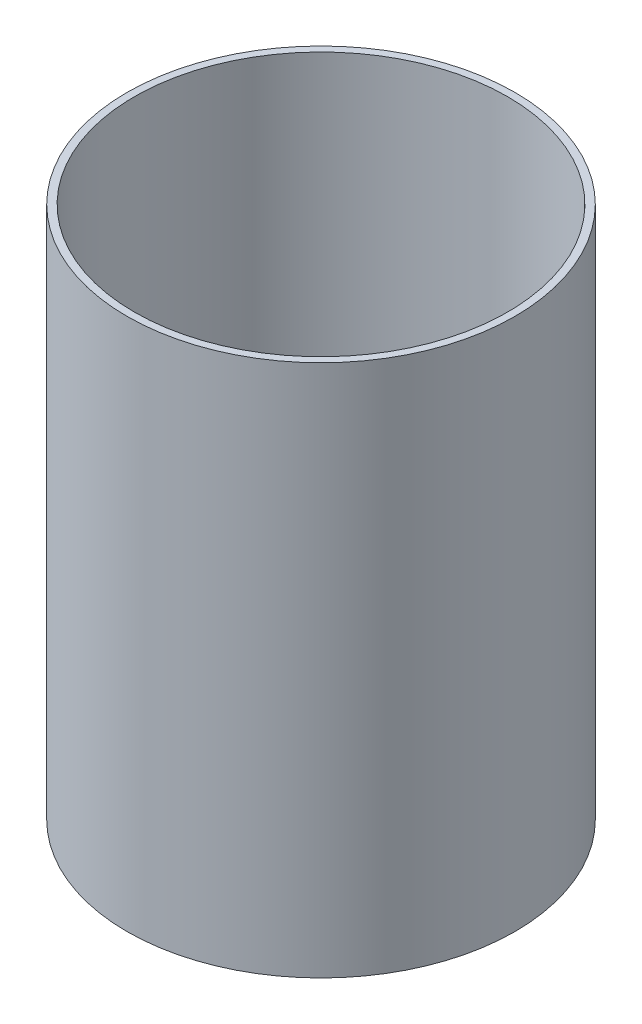
ISO-10303-21;
HEADER;
FILE_DESCRIPTION(('STEP AP214'),'2;1');
FILE_NAME('part.step','',(''),(''),'','','');
FILE_SCHEMA(('AUTOMOTIVE_DESIGN { 1 0 10303 214 1 1 1 1 }'));
ENDSEC;
DATA;
#1=APPLICATION_CONTEXT('core data for automotive mechanical design processes');
#2=APPLICATION_PROTOCOL_DEFINITION('international standard','automotive_design',2000,#1);
#3=PRODUCT_CONTEXT('',#1,'mechanical');
#4=PRODUCT('Part','Part','',(#3));
#5=PRODUCT_RELATED_PRODUCT_CATEGORY('part','',(#4));
#6=PRODUCT_DEFINITION_FORMATION('','',#4);
#7=PRODUCT_DEFINITION_CONTEXT('part definition',#1,'design');
#8=PRODUCT_DEFINITION('design','',#6,#7);
#9=PRODUCT_DEFINITION_SHAPE('','',#8);
#10=(LENGTH_UNIT() NAMED_UNIT(*) SI_UNIT(.MILLI.,.METRE.));
#11=(NAMED_UNIT(*) PLANE_ANGLE_UNIT() SI_UNIT($,.RADIAN.));
#12=(NAMED_UNIT(*) SI_UNIT($,.STERADIAN.) SOLID_ANGLE_UNIT());
#13=UNCERTAINTY_MEASURE_WITH_UNIT(LENGTH_MEASURE(1.E-05),#10,'distance_accuracy_value','');
#14=(GEOMETRIC_REPRESENTATION_CONTEXT(3) GLOBAL_UNCERTAINTY_ASSIGNED_CONTEXT((#13)) GLOBAL_UNIT_ASSIGNED_CONTEXT((#10,
#11,#12)) REPRESENTATION_CONTEXT('',''));
#15=CARTESIAN_POINT('',(0.,0.,0.));
#16=DIRECTION('',(0.,0.,1.));
#17=DIRECTION('',(1.,0.,0.));
#18=AXIS2_PLACEMENT_3D('',#15,#16,#17);
#19=CARTESIAN_POINT('',(0.,355.6,0.));
#20=DIRECTION('',(0.,1.,0.));
#21=DIRECTION('',(0.,0.,1.));
#22=AXIS2_PLACEMENT_3D('',#19,#20,#21);
#23=PLANE('',#22);
#24=CARTESIAN_POINT('',(0.,355.6,0.));
#25=DIRECTION('',(0.,1.,0.));
#26=DIRECTION('',(0.,0.,1.));
#27=AXIS2_PLACEMENT_3D('',#24,#25,#26);
#28=CIRCLE('',#27,132.);
#29=CARTESIAN_POINT('',(0.,355.6,132.));
#30=VERTEX_POINT('',#29);
#31=EDGE_CURVE('E11',#30,#30,#28,.T.);
#32=ORIENTED_EDGE('',*,*,#31,.T.);
#33=EDGE_LOOP('',(#32));
#34=FACE_BOUND('',#33,.T.);
#35=CARTESIAN_POINT('',(0.,355.6,0.));
#36=DIRECTION('',(0.,1.,0.));
#37=DIRECTION('',(0.,0.,1.));
#38=AXIS2_PLACEMENT_3D('',#35,#36,#37);
#39=CIRCLE('',#38,127.);
#40=CARTESIAN_POINT('',(0.,355.6,127.));
#41=VERTEX_POINT('',#40);
#42=EDGE_CURVE('E53',#41,#41,#39,.T.);
#43=ORIENTED_EDGE('',*,*,#42,.F.);
#44=EDGE_LOOP('',(#43));
#45=FACE_BOUND('',#44,.T.);
#46=ADVANCED_FACE('F44',(#34,#45),#23,.T.);
#47=CARTESIAN_POINT('',(0.,355.6,0.));
#48=DIRECTION('',(0.,-1.,0.));
#49=DIRECTION('',(0.,0.,-1.));
#50=AXIS2_PLACEMENT_3D('',#47,#48,#49);
#51=CYLINDRICAL_SURFACE('',#50,132.);
#52=ORIENTED_EDGE('',*,*,#31,.F.);
#53=EDGE_LOOP('',(#52));
#54=FACE_BOUND('',#53,.T.);
#55=CARTESIAN_POINT('',(0.,-7.,0.));
#56=DIRECTION('',(0.,-1.,0.));
#57=DIRECTION('',(0.,0.,-1.));
#58=AXIS2_PLACEMENT_3D('',#55,#56,#57);
#59=CIRCLE('',#58,132.);
#60=CARTESIAN_POINT('',(0.,-7.,-132.));
#61=VERTEX_POINT('',#60);
#62=EDGE_CURVE('E150',#61,#61,#59,.T.);
#63=ORIENTED_EDGE('',*,*,#62,.F.);
#64=EDGE_LOOP('',(#63));
#65=FACE_BOUND('',#64,.T.);
#66=ADVANCED_FACE('F46',(#54,#65),#51,.T.);
#67=CARTESIAN_POINT('',(0.,355.6,0.));
#68=DIRECTION('',(0.,-1.,0.));
#69=DIRECTION('',(0.,0.,-1.));
#70=AXIS2_PLACEMENT_3D('',#67,#68,#69);
#71=CYLINDRICAL_SURFACE('',#70,127.);
#72=ORIENTED_EDGE('',*,*,#42,.T.);
#73=EDGE_LOOP('',(#72));
#74=FACE_BOUND('',#73,.T.);
#75=CARTESIAN_POINT('',(0.,0.,0.));
#76=DIRECTION('',(0.,1.,0.));
#77=DIRECTION('',(0.,0.,1.));
#78=AXIS2_PLACEMENT_3D('',#75,#76,#77);
#79=CIRCLE('',#78,127.);
#80=CARTESIAN_POINT('',(0.,0.,127.));
#81=VERTEX_POINT('',#80);
#82=EDGE_CURVE('E154',#81,#81,#79,.T.);
#83=ORIENTED_EDGE('',*,*,#82,.F.);
#84=EDGE_LOOP('',(#83));
#85=FACE_BOUND('',#84,.T.);
#86=ADVANCED_FACE('F163',(#74,#85),#71,.F.);
#87=CARTESIAN_POINT('',(0.,0.,0.));
#88=DIRECTION('',(0.,-1.,0.));
#89=DIRECTION('',(0.,0.,-1.));
#90=AXIS2_PLACEMENT_3D('',#87,#88,#89);
#91=PLANE('',#90);
#92=CARTESIAN_POINT('',(-109.094426355853,0.,39.2444263558533));
#93=DIRECTION('',(0.,-1.,0.));
#94=DIRECTION('',(0.,0.,-1.));
#95=AXIS2_PLACEMENT_3D('',#92,#93,#94);
#96=CIRCLE('',#95,2.);
#97=CARTESIAN_POINT('',(-109.094426355853,0.,37.2444263558533));
#98=VERTEX_POINT('',#97);
#99=EDGE_CURVE('E254',#98,#98,#96,.T.);
#100=ORIENTED_EDGE('',*,*,#99,.T.);
#101=EDGE_LOOP('',(#100));
#102=FACE_BOUND('',#101,.T.);
#103=CARTESIAN_POINT('',(-30.6055736441465,0.,-39.2444263558533));
#104=DIRECTION('',(0.,-1.,0.));
#105=DIRECTION('',(0.,0.,-1.));
#106=AXIS2_PLACEMENT_3D('',#103,#104,#105);
#107=CIRCLE('',#106,2.);
#108=CARTESIAN_POINT('',(-30.6055736441465,0.,-41.2444263558533));
#109=VERTEX_POINT('',#108);
#110=EDGE_CURVE('E248',#109,#109,#107,.T.);
#111=ORIENTED_EDGE('',*,*,#110,.T.);
#112=EDGE_LOOP('',(#111));
#113=FACE_BOUND('',#112,.T.);
#114=CARTESIAN_POINT('',(-109.094426355853,0.,-39.2444263558533));
#115=DIRECTION('',(0.,-1.,0.));
#116=DIRECTION('',(0.,0.,-1.));
#117=AXIS2_PLACEMENT_3D('',#114,#115,#116);
#118=CIRCLE('',#117,2.);
#119=CARTESIAN_POINT('',(-109.094426355853,0.,-41.2444263558533));
#120=VERTEX_POINT('',#119);
#121=EDGE_CURVE('E245',#120,#120,#118,.T.);
#122=ORIENTED_EDGE('',*,*,#121,.T.);
#123=EDGE_LOOP('',(#122));
#124=FACE_BOUND('',#123,.T.);
#125=CARTESIAN_POINT('',(-30.6055736441465,0.,39.2444263558533));
#126=DIRECTION('',(0.,-1.,0.));
#127=DIRECTION('',(0.,0.,-1.));
#128=AXIS2_PLACEMENT_3D('',#125,#126,#127);
#129=CIRCLE('',#128,2.);
#130=CARTESIAN_POINT('',(-30.6055736441465,0.,37.2444263558533));
#131=VERTEX_POINT('',#130);
#132=EDGE_CURVE('E249',#131,#131,#129,.T.);
#133=ORIENTED_EDGE('',*,*,#132,.T.);
#134=EDGE_LOOP('',(#133));
#135=FACE_BOUND('',#134,.T.);
#136=CARTESIAN_POINT('',(-69.85,0.,0.));
#137=DIRECTION('',(0.,1.,0.));
#138=DIRECTION('',(0.,0.,1.));
#139=AXIS2_PLACEMENT_3D('',#136,#137,#138);
#140=CIRCLE('',#139,47.5);
#141=CARTESIAN_POINT('',(-69.85,0.,47.5));
#142=VERTEX_POINT('',#141);
#143=EDGE_CURVE('E264',#142,#142,#140,.T.);
#144=ORIENTED_EDGE('',*,*,#143,.F.);
#145=EDGE_LOOP('',(#144));
#146=FACE_BOUND('',#145,.T.);
#147=CARTESIAN_POINT('',(34.45,0.,-5.));
#148=DIRECTION('',(0.,-1.,0.));
#149=DIRECTION('',(0.,0.,-1.));
#150=AXIS2_PLACEMENT_3D('',#147,#148,#149);
#151=CIRCLE('',#150,2.);
#152=CARTESIAN_POINT('',(34.45,0.,-7.));
#153=VERTEX_POINT('',#152);
#154=EDGE_CURVE('E146',#153,#153,#151,.T.);
#155=ORIENTED_EDGE('',*,*,#154,.T.);
#156=EDGE_LOOP('',(#155));
#157=FACE_BOUND('',#156,.T.);
#158=CARTESIAN_POINT('',(34.45,0.,5.));
#159=DIRECTION('',(0.,-1.,0.));
#160=DIRECTION('',(0.,0.,-1.));
#161=AXIS2_PLACEMENT_3D('',#158,#159,#160);
#162=CIRCLE('',#161,2.);
#163=CARTESIAN_POINT('',(34.45,0.,3.));
#164=VERTEX_POINT('',#163);
#165=EDGE_CURVE('E142',#164,#164,#162,.T.);
#166=ORIENTED_EDGE('',*,*,#165,.T.);
#167=EDGE_LOOP('',(#166));
#168=FACE_BOUND('',#167,.T.);
#169=CARTESIAN_POINT('',(-14.05,0.,-5.));
#170=DIRECTION('',(0.,-1.,0.));
#171=DIRECTION('',(0.,0.,-1.));
#172=AXIS2_PLACEMENT_3D('',#169,#170,#171);
#173=CIRCLE('',#172,2.);
#174=CARTESIAN_POINT('',(-14.05,0.,-7.));
#175=VERTEX_POINT('',#174);
#176=EDGE_CURVE('E138',#175,#175,#173,.T.);
#177=ORIENTED_EDGE('',*,*,#176,.T.);
#178=EDGE_LOOP('',(#177));
#179=FACE_BOUND('',#178,.T.);
#180=CARTESIAN_POINT('',(-14.05,0.,5.));
#181=DIRECTION('',(0.,-1.,0.));
#182=DIRECTION('',(0.,0.,-1.));
#183=AXIS2_PLACEMENT_3D('',#180,#181,#182);
#184=CIRCLE('',#183,2.);
#185=CARTESIAN_POINT('',(-14.05,0.,3.));
#186=VERTEX_POINT('',#185);
#187=EDGE_CURVE('E134',#186,#186,#184,.T.);
#188=ORIENTED_EDGE('',*,*,#187,.T.);
#189=EDGE_LOOP('',(#188));
#190=FACE_BOUND('',#189,.T.);
#191=DIRECTION('',(-1.,0.,0.));
#192=VECTOR('',#191,1.);
#193=CARTESIAN_POINT('',(0.,0.,10.));
#194=LINE('',#193,#192);
#195=CARTESIAN_POINT('',(30.,0.,10.));
#196=VERTEX_POINT('',#195);
#197=CARTESIAN_POINT('',(-10.05,0.,10.));
#198=VERTEX_POINT('',#197);
#199=EDGE_CURVE('E126',#196,#198,#194,.T.);
#200=ORIENTED_EDGE('',*,*,#199,.T.);
#201=DIRECTION('',(0.,0.,-1.));
#202=VECTOR('',#201,1.);
#203=CARTESIAN_POINT('',(-10.05,0.,0.));
#204=LINE('',#203,#202);
#205=CARTESIAN_POINT('',(-10.05,0.,-10.));
#206=VERTEX_POINT('',#205);
#207=EDGE_CURVE('E130',#198,#206,#204,.T.);
#208=ORIENTED_EDGE('',*,*,#207,.T.);
#209=DIRECTION('',(1.,0.,0.));
#210=VECTOR('',#209,1.);
#211=CARTESIAN_POINT('',(0.,0.,-10.));
#212=LINE('',#211,#210);
#213=CARTESIAN_POINT('',(30.,0.,-10.));
#214=VERTEX_POINT('',#213);
#215=EDGE_CURVE('E117',#206,#214,#212,.T.);
#216=ORIENTED_EDGE('',*,*,#215,.T.);
#217=DIRECTION('',(0.,0.,1.));
#218=VECTOR('',#217,1.);
#219=CARTESIAN_POINT('',(30.,0.,0.));
#220=LINE('',#219,#218);
#221=EDGE_CURVE('E92',#214,#196,#220,.T.);
#222=ORIENTED_EDGE('',*,*,#221,.T.);
#223=EDGE_LOOP('',(#200,#208,#216,#222));
#224=FACE_BOUND('',#223,.T.);
#225=ORIENTED_EDGE('',*,*,#82,.T.);
#226=EDGE_LOOP('',(#225));
#227=FACE_BOUND('',#226,.T.);
#228=ADVANCED_FACE('F161',(#102,#113,#124,#135,#146,#157,#168,#179,#190,#224,#227),#91,.F.);
#229=CARTESIAN_POINT('',(0.,-7.,0.));
#230=DIRECTION('',(0.,-1.,0.));
#231=DIRECTION('',(0.,0.,-1.));
#232=AXIS2_PLACEMENT_3D('',#229,#230,#231);
#233=PLANE('',#232);
#234=CARTESIAN_POINT('',(-109.094426355853,-7.,39.2444263558533));
#235=DIRECTION('',(0.,-1.,0.));
#236=DIRECTION('',(0.,0.,-1.));
#237=AXIS2_PLACEMENT_3D('',#234,#235,#236);
#238=CIRCLE('',#237,2.);
#239=CARTESIAN_POINT('',(-109.094426355853,-7.,37.2444263558533));
#240=VERTEX_POINT('',#239);
#241=EDGE_CURVE('E326',#240,#240,#238,.T.);
#242=ORIENTED_EDGE('',*,*,#241,.F.);
#243=EDGE_LOOP('',(#242));
#244=FACE_BOUND('',#243,.T.);
#245=CARTESIAN_POINT('',(-30.6055736441465,-7.,-39.2444263558533));
#246=DIRECTION('',(0.,-1.,0.));
#247=DIRECTION('',(0.,0.,-1.));
#248=AXIS2_PLACEMENT_3D('',#245,#246,#247);
#249=CIRCLE('',#248,2.);
#250=CARTESIAN_POINT('',(-30.6055736441465,-7.,-41.2444263558533));
#251=VERTEX_POINT('',#250);
#252=EDGE_CURVE('E327',#251,#251,#249,.T.);
#253=ORIENTED_EDGE('',*,*,#252,.F.);
#254=EDGE_LOOP('',(#253));
#255=FACE_BOUND('',#254,.T.);
#256=CARTESIAN_POINT('',(-109.094426355853,-7.,-39.2444263558533));
#257=DIRECTION('',(0.,-1.,0.));
#258=DIRECTION('',(0.,0.,-1.));
#259=AXIS2_PLACEMENT_3D('',#256,#257,#258);
#260=CIRCLE('',#259,2.);
#261=CARTESIAN_POINT('',(-109.094426355853,-7.,-41.2444263558533));
#262=VERTEX_POINT('',#261);
#263=EDGE_CURVE('E242',#262,#262,#260,.T.);
#264=ORIENTED_EDGE('',*,*,#263,.F.);
#265=EDGE_LOOP('',(#264));
#266=FACE_BOUND('',#265,.T.);
#267=CARTESIAN_POINT('',(-30.6055736441465,-7.,39.2444263558533));
#268=DIRECTION('',(0.,-1.,0.));
#269=DIRECTION('',(0.,0.,-1.));
#270=AXIS2_PLACEMENT_3D('',#267,#268,#269);
#271=CIRCLE('',#270,2.);
#272=CARTESIAN_POINT('',(-30.6055736441465,-7.,37.2444263558533));
#273=VERTEX_POINT('',#272);
#274=EDGE_CURVE('E257',#273,#273,#271,.T.);
#275=ORIENTED_EDGE('',*,*,#274,.F.);
#276=EDGE_LOOP('',(#275));
#277=FACE_BOUND('',#276,.T.);
#278=CARTESIAN_POINT('',(-69.85,-7.,0.));
#279=DIRECTION('',(0.,1.,0.));
#280=DIRECTION('',(0.,0.,1.));
#281=AXIS2_PLACEMENT_3D('',#278,#279,#280);
#282=CIRCLE('',#281,47.5);
#283=CARTESIAN_POINT('',(-69.85,-7.,47.5));
#284=VERTEX_POINT('',#283);
#285=EDGE_CURVE('E265',#284,#284,#282,.T.);
#286=ORIENTED_EDGE('',*,*,#285,.T.);
#287=EDGE_LOOP('',(#286));
#288=FACE_BOUND('',#287,.T.);
#289=CARTESIAN_POINT('',(34.45,-7.,-5.));
#290=DIRECTION('',(0.,-1.,0.));
#291=DIRECTION('',(0.,0.,-1.));
#292=AXIS2_PLACEMENT_3D('',#289,#290,#291);
#293=CIRCLE('',#292,2.);
#294=CARTESIAN_POINT('',(34.45,-7.,-7.));
#295=VERTEX_POINT('',#294);
#296=EDGE_CURVE('E269',#295,#295,#293,.T.);
#297=ORIENTED_EDGE('',*,*,#296,.F.);
#298=EDGE_LOOP('',(#297));
#299=FACE_BOUND('',#298,.T.);
#300=CARTESIAN_POINT('',(34.45,-7.,5.));
#301=DIRECTION('',(0.,-1.,0.));
#302=DIRECTION('',(0.,0.,-1.));
#303=AXIS2_PLACEMENT_3D('',#300,#301,#302);
#304=CIRCLE('',#303,2.);
#305=CARTESIAN_POINT('',(34.45,-7.,3.));
#306=VERTEX_POINT('',#305);
#307=EDGE_CURVE('E281',#306,#306,#304,.T.);
#308=ORIENTED_EDGE('',*,*,#307,.F.);
#309=EDGE_LOOP('',(#308));
#310=FACE_BOUND('',#309,.T.);
#311=CARTESIAN_POINT('',(-14.05,-7.,-5.));
#312=DIRECTION('',(0.,-1.,0.));
#313=DIRECTION('',(0.,0.,-1.));
#314=AXIS2_PLACEMENT_3D('',#311,#312,#313);
#315=CIRCLE('',#314,2.);
#316=CARTESIAN_POINT('',(-14.05,-7.,-7.));
#317=VERTEX_POINT('',#316);
#318=EDGE_CURVE('E277',#317,#317,#315,.T.);
#319=ORIENTED_EDGE('',*,*,#318,.F.);
#320=EDGE_LOOP('',(#319));
#321=FACE_BOUND('',#320,.T.);
#322=CARTESIAN_POINT('',(-14.05,-7.,5.));
#323=DIRECTION('',(0.,-1.,0.));
#324=DIRECTION('',(0.,0.,-1.));
#325=AXIS2_PLACEMENT_3D('',#322,#323,#324);
#326=CIRCLE('',#325,2.);
#327=CARTESIAN_POINT('',(-14.05,-7.,3.));
#328=VERTEX_POINT('',#327);
#329=EDGE_CURVE('E273',#328,#328,#326,.T.);
#330=ORIENTED_EDGE('',*,*,#329,.F.);
#331=EDGE_LOOP('',(#330));
#332=FACE_BOUND('',#331,.T.);
#333=DIRECTION('',(0.,0.,-1.));
#334=VECTOR('',#333,1.);
#335=CARTESIAN_POINT('',(-10.05,-7.,10.));
#336=LINE('',#335,#334);
#337=CARTESIAN_POINT('',(-10.05,-7.,10.));
#338=VERTEX_POINT('',#337);
#339=CARTESIAN_POINT('',(-10.05,-7.,-10.));
#340=VERTEX_POINT('',#339);
#341=EDGE_CURVE('E68',#338,#340,#336,.T.);
#342=ORIENTED_EDGE('',*,*,#341,.F.);
#343=DIRECTION('',(-1.,0.,0.));
#344=VECTOR('',#343,1.);
#345=CARTESIAN_POINT('',(-10.05,-7.,10.));
#346=LINE('',#345,#344);
#347=CARTESIAN_POINT('',(30.,-7.,10.));
#348=VERTEX_POINT('',#347);
#349=EDGE_CURVE('E107',#348,#338,#346,.T.);
#350=ORIENTED_EDGE('',*,*,#349,.F.);
#351=DIRECTION('',(0.,0.,1.));
#352=VECTOR('',#351,1.);
#353=CARTESIAN_POINT('',(30.,-7.,10.));
#354=LINE('',#353,#352);
#355=CARTESIAN_POINT('',(30.,-7.,-10.));
#356=VERTEX_POINT('',#355);
#357=EDGE_CURVE('E89',#356,#348,#354,.T.);
#358=ORIENTED_EDGE('',*,*,#357,.F.);
#359=DIRECTION('',(1.,0.,0.));
#360=VECTOR('',#359,1.);
#361=CARTESIAN_POINT('',(-10.05,-7.,-10.));
#362=LINE('',#361,#360);
#363=EDGE_CURVE('E99',#340,#356,#362,.T.);
#364=ORIENTED_EDGE('',*,*,#363,.F.);
#365=EDGE_LOOP('',(#342,#350,#358,#364));
#366=FACE_BOUND('',#365,.T.);
#367=ORIENTED_EDGE('',*,*,#62,.T.);
#368=EDGE_LOOP('',(#367));
#369=FACE_BOUND('',#368,.T.);
#370=ADVANCED_FACE('F104',(#244,#255,#266,#277,#288,#299,#310,#321,#332,#366,#369),#233,.T.);
#371=CARTESIAN_POINT('',(-10.05,355.6,10.));
#372=DIRECTION('',(-1.,0.,0.));
#373=DIRECTION('',(0.,0.,1.));
#374=AXIS2_PLACEMENT_3D('',#371,#372,#373);
#375=PLANE('',#374);
#376=DIRECTION('',(0.,-1.,0.));
#377=VECTOR('',#376,1.);
#378=CARTESIAN_POINT('',(-10.05,355.6,10.));
#379=LINE('',#378,#377);
#380=EDGE_CURVE('E114',#198,#338,#379,.T.);
#381=ORIENTED_EDGE('',*,*,#380,.T.);
#382=ORIENTED_EDGE('',*,*,#341,.T.);
#383=DIRECTION('',(0.,-1.,0.));
#384=VECTOR('',#383,1.);
#385=CARTESIAN_POINT('',(-10.05,355.6,-10.));
#386=LINE('',#385,#384);
#387=EDGE_CURVE('E96',#206,#340,#386,.T.);
#388=ORIENTED_EDGE('',*,*,#387,.F.);
#389=ORIENTED_EDGE('',*,*,#207,.F.);
#390=EDGE_LOOP('',(#381,#382,#388,#389));
#391=FACE_BOUND('',#390,.T.);
#392=ADVANCED_FACE('F184',(#391),#375,.F.);
#393=CARTESIAN_POINT('',(-10.05,355.6,10.));
#394=DIRECTION('',(0.,0.,1.));
#395=DIRECTION('',(1.,0.,0.));
#396=AXIS2_PLACEMENT_3D('',#393,#394,#395);
#397=PLANE('',#396);
#398=DIRECTION('',(0.,-1.,0.));
#399=VECTOR('',#398,1.);
#400=CARTESIAN_POINT('',(30.,355.6,10.));
#401=LINE('',#400,#399);
#402=EDGE_CURVE('E95',#196,#348,#401,.T.);
#403=ORIENTED_EDGE('',*,*,#402,.T.);
#404=ORIENTED_EDGE('',*,*,#349,.T.);
#405=ORIENTED_EDGE('',*,*,#380,.F.);
#406=ORIENTED_EDGE('',*,*,#199,.F.);
#407=EDGE_LOOP('',(#403,#404,#405,#406));
#408=FACE_BOUND('',#407,.T.);
#409=ADVANCED_FACE('F191',(#408),#397,.F.);
#410=CARTESIAN_POINT('',(30.,355.6,10.));
#411=DIRECTION('',(1.,0.,0.));
#412=DIRECTION('',(0.,0.,-1.));
#413=AXIS2_PLACEMENT_3D('',#410,#411,#412);
#414=PLANE('',#413);
#415=DIRECTION('',(0.,-1.,0.));
#416=VECTOR('',#415,1.);
#417=CARTESIAN_POINT('',(30.,355.6,-10.));
#418=LINE('',#417,#416);
#419=EDGE_CURVE('E60',#214,#356,#418,.T.);
#420=ORIENTED_EDGE('',*,*,#419,.T.);
#421=ORIENTED_EDGE('',*,*,#357,.T.);
#422=ORIENTED_EDGE('',*,*,#402,.F.);
#423=ORIENTED_EDGE('',*,*,#221,.F.);
#424=EDGE_LOOP('',(#420,#421,#422,#423));
#425=FACE_BOUND('',#424,.T.);
#426=ADVANCED_FACE('F86',(#425),#414,.F.);
#427=CARTESIAN_POINT('',(-10.05,355.6,-10.));
#428=DIRECTION('',(0.,0.,-1.));
#429=DIRECTION('',(-1.,0.,0.));
#430=AXIS2_PLACEMENT_3D('',#427,#428,#429);
#431=PLANE('',#430);
#432=ORIENTED_EDGE('',*,*,#387,.T.);
#433=ORIENTED_EDGE('',*,*,#363,.T.);
#434=ORIENTED_EDGE('',*,*,#419,.F.);
#435=ORIENTED_EDGE('',*,*,#215,.F.);
#436=EDGE_LOOP('',(#432,#433,#434,#435));
#437=FACE_BOUND('',#436,.T.);
#438=ADVANCED_FACE('F100',(#437),#431,.F.);
#439=CARTESIAN_POINT('',(-14.05,355.6,5.));
#440=DIRECTION('',(0.,-1.,0.));
#441=DIRECTION('',(0.,0.,-1.));
#442=AXIS2_PLACEMENT_3D('',#439,#440,#441);
#443=CYLINDRICAL_SURFACE('',#442,2.);
#444=ORIENTED_EDGE('',*,*,#329,.T.);
#445=EDGE_LOOP('',(#444));
#446=FACE_BOUND('',#445,.T.);
#447=ORIENTED_EDGE('',*,*,#187,.F.);
#448=EDGE_LOOP('',(#447));
#449=FACE_BOUND('',#448,.T.);
#450=ADVANCED_FACE('F198',(#446,#449),#443,.F.);
#451=CARTESIAN_POINT('',(-14.05,355.6,-5.));
#452=DIRECTION('',(0.,-1.,0.));
#453=DIRECTION('',(0.,0.,-1.));
#454=AXIS2_PLACEMENT_3D('',#451,#452,#453);
#455=CYLINDRICAL_SURFACE('',#454,2.);
#456=ORIENTED_EDGE('',*,*,#318,.T.);
#457=EDGE_LOOP('',(#456));
#458=FACE_BOUND('',#457,.T.);
#459=ORIENTED_EDGE('',*,*,#176,.F.);
#460=EDGE_LOOP('',(#459));
#461=FACE_BOUND('',#460,.T.);
#462=ADVANCED_FACE('F212',(#458,#461),#455,.F.);
#463=CARTESIAN_POINT('',(34.45,355.6,5.));
#464=DIRECTION('',(0.,-1.,0.));
#465=DIRECTION('',(0.,0.,-1.));
#466=AXIS2_PLACEMENT_3D('',#463,#464,#465);
#467=CYLINDRICAL_SURFACE('',#466,2.);
#468=ORIENTED_EDGE('',*,*,#307,.T.);
#469=EDGE_LOOP('',(#468));
#470=FACE_BOUND('',#469,.T.);
#471=ORIENTED_EDGE('',*,*,#165,.F.);
#472=EDGE_LOOP('',(#471));
#473=FACE_BOUND('',#472,.T.);
#474=ADVANCED_FACE('F208',(#470,#473),#467,.F.);
#475=CARTESIAN_POINT('',(34.45,355.6,-5.));
#476=DIRECTION('',(0.,-1.,0.));
#477=DIRECTION('',(0.,0.,-1.));
#478=AXIS2_PLACEMENT_3D('',#475,#476,#477);
#479=CYLINDRICAL_SURFACE('',#478,2.);
#480=ORIENTED_EDGE('',*,*,#296,.T.);
#481=EDGE_LOOP('',(#480));
#482=FACE_BOUND('',#481,.T.);
#483=ORIENTED_EDGE('',*,*,#154,.F.);
#484=EDGE_LOOP('',(#483));
#485=FACE_BOUND('',#484,.T.);
#486=ADVANCED_FACE('F204',(#482,#485),#479,.F.);
#487=CARTESIAN_POINT('',(-69.85,-7.,0.));
#488=DIRECTION('',(0.,1.,0.));
#489=DIRECTION('',(0.,0.,1.));
#490=AXIS2_PLACEMENT_3D('',#487,#488,#489);
#491=CYLINDRICAL_SURFACE('',#490,47.5);
#492=ORIENTED_EDGE('',*,*,#285,.F.);
#493=EDGE_LOOP('',(#492));
#494=FACE_BOUND('',#493,.T.);
#495=ORIENTED_EDGE('',*,*,#143,.T.);
#496=EDGE_LOOP('',(#495));
#497=FACE_BOUND('',#496,.T.);
#498=ADVANCED_FACE('F207',(#494,#497),#491,.F.);
#499=CARTESIAN_POINT('',(-30.6055736441465,355.6,39.2444263558533));
#500=DIRECTION('',(0.,-1.,0.));
#501=DIRECTION('',(0.,0.,-1.));
#502=AXIS2_PLACEMENT_3D('',#499,#500,#501);
#503=CYLINDRICAL_SURFACE('',#502,2.);
#504=ORIENTED_EDGE('',*,*,#274,.T.);
#505=EDGE_LOOP('',(#504));
#506=FACE_BOUND('',#505,.T.);
#507=ORIENTED_EDGE('',*,*,#132,.F.);
#508=EDGE_LOOP('',(#507));
#509=FACE_BOUND('',#508,.T.);
#510=ADVANCED_FACE('F222',(#506,#509),#503,.F.);
#511=CARTESIAN_POINT('',(-109.094426355853,355.6,-39.2444263558533));
#512=DIRECTION('',(0.,-1.,0.));
#513=DIRECTION('',(0.,0.,-1.));
#514=AXIS2_PLACEMENT_3D('',#511,#512,#513);
#515=CYLINDRICAL_SURFACE('',#514,2.);
#516=ORIENTED_EDGE('',*,*,#263,.T.);
#517=EDGE_LOOP('',(#516));
#518=FACE_BOUND('',#517,.T.);
#519=ORIENTED_EDGE('',*,*,#121,.F.);
#520=EDGE_LOOP('',(#519));
#521=FACE_BOUND('',#520,.T.);
#522=ADVANCED_FACE('F225',(#518,#521),#515,.F.);
#523=CARTESIAN_POINT('',(-30.6055736441465,355.6,-39.2444263558533));
#524=DIRECTION('',(0.,-1.,0.));
#525=DIRECTION('',(0.,0.,-1.));
#526=AXIS2_PLACEMENT_3D('',#523,#524,#525);
#527=CYLINDRICAL_SURFACE('',#526,2.);
#528=ORIENTED_EDGE('',*,*,#252,.T.);
#529=EDGE_LOOP('',(#528));
#530=FACE_BOUND('',#529,.T.);
#531=ORIENTED_EDGE('',*,*,#110,.F.);
#532=EDGE_LOOP('',(#531));
#533=FACE_BOUND('',#532,.T.);
#534=ADVANCED_FACE('F227',(#530,#533),#527,.F.);
#535=CARTESIAN_POINT('',(-109.094426355853,355.6,39.2444263558533));
#536=DIRECTION('',(0.,-1.,0.));
#537=DIRECTION('',(0.,0.,-1.));
#538=AXIS2_PLACEMENT_3D('',#535,#536,#537);
#539=CYLINDRICAL_SURFACE('',#538,2.);
#540=ORIENTED_EDGE('',*,*,#241,.T.);
#541=EDGE_LOOP('',(#540));
#542=FACE_BOUND('',#541,.T.);
#543=ORIENTED_EDGE('',*,*,#99,.F.);
#544=EDGE_LOOP('',(#543));
#545=FACE_BOUND('',#544,.T.);
#546=ADVANCED_FACE('F230',(#542,#545),#539,.F.);
#547=CLOSED_SHELL('',(#46,#66,#86,#228,#370,#392,#409,#426,#438,#450,#462,#474,#486,#498,#510,
#522,#534,#546));
#548=MANIFOLD_SOLID_BREP('B2',#547);
#549=ADVANCED_BREP_SHAPE_REPRESENTATION('',(#18,#548),#14);
#550=SHAPE_DEFINITION_REPRESENTATION(#9,#549);
ENDSEC;
END-ISO-10303-21;
